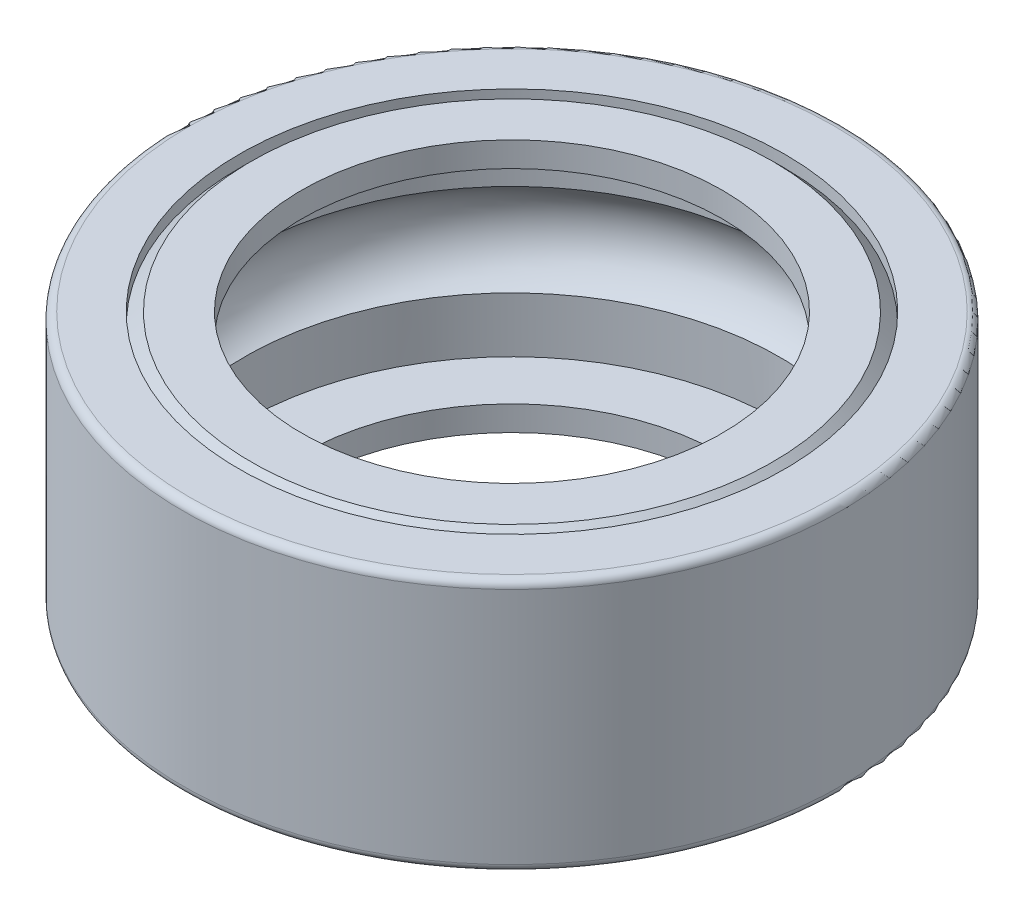
ISO-10303-21;
HEADER;
FILE_DESCRIPTION(('STEP AP214'),'2;1');
FILE_NAME('part.step','',(''),(''),'','','');
FILE_SCHEMA(('AUTOMOTIVE_DESIGN { 1 0 10303 214 1 1 1 1 }'));
ENDSEC;
DATA;
#1=APPLICATION_CONTEXT('core data for automotive mechanical design processes');
#2=APPLICATION_PROTOCOL_DEFINITION('international standard','automotive_design',2000,#1);
#3=PRODUCT_CONTEXT('',#1,'mechanical');
#4=PRODUCT('Part','Part','',(#3));
#5=PRODUCT_RELATED_PRODUCT_CATEGORY('part','',(#4));
#6=PRODUCT_DEFINITION_FORMATION('','',#4);
#7=PRODUCT_DEFINITION_CONTEXT('part definition',#1,'design');
#8=PRODUCT_DEFINITION('design','',#6,#7);
#9=PRODUCT_DEFINITION_SHAPE('','',#8);
#10=(LENGTH_UNIT() NAMED_UNIT(*) SI_UNIT(.MILLI.,.METRE.));
#11=(NAMED_UNIT(*) PLANE_ANGLE_UNIT() SI_UNIT($,.RADIAN.));
#12=(NAMED_UNIT(*) SI_UNIT($,.STERADIAN.) SOLID_ANGLE_UNIT());
#13=UNCERTAINTY_MEASURE_WITH_UNIT(LENGTH_MEASURE(1.E-05),#10,'distance_accuracy_value','');
#14=(GEOMETRIC_REPRESENTATION_CONTEXT(3) GLOBAL_UNCERTAINTY_ASSIGNED_CONTEXT((#13)) GLOBAL_UNIT_ASSIGNED_CONTEXT((#10,
#11,#12)) REPRESENTATION_CONTEXT('',''));
#15=CARTESIAN_POINT('',(0.,0.,0.));
#16=DIRECTION('',(0.,0.,1.));
#17=DIRECTION('',(1.,0.,0.));
#18=AXIS2_PLACEMENT_3D('',#15,#16,#17);
#19=CARTESIAN_POINT('',(0.,-1.04533666301317,0.));
#20=DIRECTION('',(0.,1.,0.));
#21=DIRECTION('',(0.,0.,1.));
#22=AXIS2_PLACEMENT_3D('',#19,#20,#21);
#23=CYLINDRICAL_SURFACE('',#22,5.275);
#24=CARTESIAN_POINT('',(0.,-1.59067332602634,0.));
#25=DIRECTION('',(0.,1.,0.));
#26=DIRECTION('',(0.,0.,1.));
#27=AXIS2_PLACEMENT_3D('',#24,#25,#26);
#28=CIRCLE('',#27,5.275);
#29=CARTESIAN_POINT('',(2.6375,-1.59067332602634,4.56828400496292));
#30=VERTEX_POINT('',#29);
#31=EDGE_CURVE('E97',#30,#30,#28,.T.);
#32=ORIENTED_EDGE('',*,*,#31,.F.);
#33=EDGE_LOOP('',(#32));
#34=FACE_BOUND('',#33,.T.);
#35=CARTESIAN_POINT('',(0.,-0.5,0.));
#36=DIRECTION('',(0.,1.,0.));
#37=DIRECTION('',(0.,0.,1.));
#38=AXIS2_PLACEMENT_3D('',#35,#36,#37);
#39=CIRCLE('',#38,5.275);
#40=CARTESIAN_POINT('',(0.,-0.5,-5.275));
#41=VERTEX_POINT('',#40);
#42=EDGE_CURVE('E11',#41,#41,#39,.T.);
#43=ORIENTED_EDGE('',*,*,#42,.T.);
#44=EDGE_LOOP('',(#43));
#45=FACE_BOUND('',#44,.T.);
#46=ADVANCED_FACE('F17',(#34,#45),#23,.F.);
#47=CARTESIAN_POINT('',(0.,-0.5,5.32775));
#48=DIRECTION('',(0.,1.,0.));
#49=DIRECTION('',(1.,0.,0.));
#50=AXIS2_PLACEMENT_3D('',#47,#48,#49);
#51=PLANE('',#50);
#52=CARTESIAN_POINT('',(0.,-0.5,0.));
#53=DIRECTION('',(0.,1.,0.));
#54=DIRECTION('',(0.,0.,1.));
#55=AXIS2_PLACEMENT_3D('',#52,#53,#54);
#56=CIRCLE('',#55,5.3805);
#57=CARTESIAN_POINT('',(0.,-0.5,-5.3805));
#58=VERTEX_POINT('',#57);
#59=EDGE_CURVE('E109',#58,#58,#56,.T.);
#60=ORIENTED_EDGE('',*,*,#59,.T.);
#61=EDGE_LOOP('',(#60));
#62=FACE_BOUND('',#61,.T.);
#63=ORIENTED_EDGE('',*,*,#42,.F.);
#64=EDGE_LOOP('',(#63));
#65=FACE_BOUND('',#64,.T.);
#66=ADVANCED_FACE('F188',(#62,#65),#51,.T.);
#67=CARTESIAN_POINT('',(0.,-3.95466333698683,0.));
#68=DIRECTION('',(0.,1.,0.));
#69=DIRECTION('',(0.,0.,1.));
#70=AXIS2_PLACEMENT_3D('',#67,#68,#69);
#71=CYLINDRICAL_SURFACE('',#70,5.275);
#72=CARTESIAN_POINT('',(0.,-4.5,0.));
#73=DIRECTION('',(0.,1.,0.));
#74=DIRECTION('',(0.,0.,1.));
#75=AXIS2_PLACEMENT_3D('',#72,#73,#74);
#76=CIRCLE('',#75,5.275);
#77=CARTESIAN_POINT('',(0.,-4.5,-5.275));
#78=VERTEX_POINT('',#77);
#79=EDGE_CURVE('E29',#78,#78,#76,.T.);
#80=ORIENTED_EDGE('',*,*,#79,.F.);
#81=EDGE_LOOP('',(#80));
#82=FACE_BOUND('',#81,.T.);
#83=CARTESIAN_POINT('',(0.,-3.40932667397366,0.));
#84=DIRECTION('',(0.,1.,0.));
#85=DIRECTION('',(0.,0.,1.));
#86=AXIS2_PLACEMENT_3D('',#83,#84,#85);
#87=CIRCLE('',#86,5.275);
#88=CARTESIAN_POINT('',(2.6375,-3.40932667397366,4.56828400496291));
#89=VERTEX_POINT('',#88);
#90=EDGE_CURVE('E107',#89,#89,#87,.T.);
#91=ORIENTED_EDGE('',*,*,#90,.T.);
#92=EDGE_LOOP('',(#91));
#93=FACE_BOUND('',#92,.T.);
#94=ADVANCED_FACE('F193',(#82,#93),#71,.F.);
#95=CARTESIAN_POINT('',(0.,-4.5,5.32775));
#96=DIRECTION('',(0.,-1.,0.));
#97=DIRECTION('',(-1.,0.,0.));
#98=AXIS2_PLACEMENT_3D('',#95,#96,#97);
#99=PLANE('',#98);
#100=ORIENTED_EDGE('',*,*,#79,.T.);
#101=EDGE_LOOP('',(#100));
#102=FACE_BOUND('',#101,.T.);
#103=CARTESIAN_POINT('',(0.,-4.5,0.));
#104=DIRECTION('',(0.,1.,0.));
#105=DIRECTION('',(0.,0.,1.));
#106=AXIS2_PLACEMENT_3D('',#103,#104,#105);
#107=CIRCLE('',#106,5.3805);
#108=CARTESIAN_POINT('',(0.,-4.5,-5.3805));
#109=VERTEX_POINT('',#108);
#110=EDGE_CURVE('E82',#109,#109,#107,.T.);
#111=ORIENTED_EDGE('',*,*,#110,.F.);
#112=EDGE_LOOP('',(#111));
#113=FACE_BOUND('',#112,.T.);
#114=ADVANCED_FACE('F203',(#102,#113),#99,.T.);
#115=CARTESIAN_POINT('',(0.,-0.25,0.));
#116=DIRECTION('',(0.,1.,0.));
#117=DIRECTION('',(0.,0.,1.));
#118=AXIS2_PLACEMENT_3D('',#115,#116,#117);
#119=CYLINDRICAL_SURFACE('',#118,5.3805);
#120=ORIENTED_EDGE('',*,*,#59,.F.);
#121=EDGE_LOOP('',(#120));
#122=FACE_BOUND('',#121,.T.);
#123=CARTESIAN_POINT('',(0.,-0.49,0.));
#124=DIRECTION('',(0.,1.,0.));
#125=DIRECTION('',(0.,0.,1.));
#126=AXIS2_PLACEMENT_3D('',#123,#124,#125);
#127=CIRCLE('',#126,5.3805);
#128=CARTESIAN_POINT('',(0.,-0.49,-5.3805));
#129=VERTEX_POINT('',#128);
#130=EDGE_CURVE('E86',#129,#129,#127,.T.);
#131=ORIENTED_EDGE('',*,*,#130,.T.);
#132=EDGE_LOOP('',(#131));
#133=FACE_BOUND('',#132,.T.);
#134=ADVANCED_FACE('F90',(#122,#133),#119,.F.);
#135=CARTESIAN_POINT('',(0.,-2.5,0.));
#136=DIRECTION('',(0.,1.,0.));
#137=DIRECTION('',(0.,0.,1.));
#138=AXIS2_PLACEMENT_3D('',#135,#136,#137);
#139=TOROIDAL_SURFACE('',#138,4.75,1.05);
#140=ORIENTED_EDGE('',*,*,#90,.F.);
#141=EDGE_LOOP('',(#140));
#142=FACE_BOUND('',#141,.T.);
#143=ORIENTED_EDGE('',*,*,#31,.T.);
#144=EDGE_LOOP('',(#143));
#145=FACE_BOUND('',#144,.T.);
#146=ADVANCED_FACE('F210',(#142,#145),#139,.F.);
#147=CARTESIAN_POINT('',(0.,-4.75,0.));
#148=DIRECTION('',(0.,1.,0.));
#149=DIRECTION('',(0.,0.,1.));
#150=AXIS2_PLACEMENT_3D('',#147,#148,#149);
#151=CYLINDRICAL_SURFACE('',#150,5.3805);
#152=CARTESIAN_POINT('',(0.,-4.51,0.));
#153=DIRECTION('',(0.,-1.,0.));
#154=DIRECTION('',(0.,0.,1.));
#155=AXIS2_PLACEMENT_3D('',#152,#153,#154);
#156=CIRCLE('',#155,5.3805);
#157=CARTESIAN_POINT('',(0.,-4.51,-5.3805));
#158=VERTEX_POINT('',#157);
#159=EDGE_CURVE('E95',#158,#158,#156,.T.);
#160=ORIENTED_EDGE('',*,*,#159,.T.);
#161=EDGE_LOOP('',(#160));
#162=FACE_BOUND('',#161,.T.);
#163=ORIENTED_EDGE('',*,*,#110,.T.);
#164=EDGE_LOOP('',(#163));
#165=FACE_BOUND('',#164,.T.);
#166=ADVANCED_FACE('F201',(#162,#165),#151,.F.);
#167=CARTESIAN_POINT('',(0.,-0.49,4.7655));
#168=DIRECTION('',(0.,-1.,0.));
#169=DIRECTION('',(-1.,0.,0.));
#170=AXIS2_PLACEMENT_3D('',#167,#168,#169);
#171=PLANE('',#170);
#172=CARTESIAN_POINT('',(0.,-0.49,0.));
#173=DIRECTION('',(0.,1.,0.));
#174=DIRECTION('',(0.,0.,1.));
#175=AXIS2_PLACEMENT_3D('',#172,#173,#174);
#176=CIRCLE('',#175,4.1505);
#177=CARTESIAN_POINT('',(0.,-0.49,-4.1505));
#178=VERTEX_POINT('',#177);
#179=EDGE_CURVE('E105',#178,#178,#176,.T.);
#180=ORIENTED_EDGE('',*,*,#179,.T.);
#181=EDGE_LOOP('',(#180));
#182=FACE_BOUND('',#181,.T.);
#183=ORIENTED_EDGE('',*,*,#130,.F.);
#184=EDGE_LOOP('',(#183));
#185=FACE_BOUND('',#184,.T.);
#186=ADVANCED_FACE('F206',(#182,#185),#171,.T.);
#187=CARTESIAN_POINT('',(0.,-4.51,4.7655));
#188=DIRECTION('',(0.,1.,0.));
#189=DIRECTION('',(1.,0.,0.));
#190=AXIS2_PLACEMENT_3D('',#187,#188,#189);
#191=PLANE('',#190);
#192=CARTESIAN_POINT('',(0.,-4.51,0.));
#193=DIRECTION('',(0.,-1.,0.));
#194=DIRECTION('',(0.,0.,1.));
#195=AXIS2_PLACEMENT_3D('',#192,#193,#194);
#196=CIRCLE('',#195,4.1505);
#197=CARTESIAN_POINT('',(0.,-4.51,-4.1505));
#198=VERTEX_POINT('',#197);
#199=EDGE_CURVE('E124',#198,#198,#196,.T.);
#200=ORIENTED_EDGE('',*,*,#199,.T.);
#201=EDGE_LOOP('',(#200));
#202=FACE_BOUND('',#201,.T.);
#203=ORIENTED_EDGE('',*,*,#159,.F.);
#204=EDGE_LOOP('',(#203));
#205=FACE_BOUND('',#204,.T.);
#206=ADVANCED_FACE('F212',(#202,#205),#191,.T.);
#207=CARTESIAN_POINT('',(0.,-0.245,0.));
#208=DIRECTION('',(0.,1.,0.));
#209=DIRECTION('',(0.,0.,1.));
#210=AXIS2_PLACEMENT_3D('',#207,#208,#209);
#211=CYLINDRICAL_SURFACE('',#210,4.1505);
#212=ORIENTED_EDGE('',*,*,#179,.F.);
#213=EDGE_LOOP('',(#212));
#214=FACE_BOUND('',#213,.T.);
#215=CARTESIAN_POINT('',(0.,0.,0.));
#216=DIRECTION('',(0.,1.,0.));
#217=DIRECTION('',(0.,0.,1.));
#218=AXIS2_PLACEMENT_3D('',#215,#216,#217);
#219=CIRCLE('',#218,4.1505);
#220=CARTESIAN_POINT('',(0.,0.,-4.1505));
#221=VERTEX_POINT('',#220);
#222=EDGE_CURVE('E106',#221,#221,#219,.T.);
#223=ORIENTED_EDGE('',*,*,#222,.T.);
#224=EDGE_LOOP('',(#223));
#225=FACE_BOUND('',#224,.T.);
#226=ADVANCED_FACE('F220',(#214,#225),#211,.F.);
#227=CARTESIAN_POINT('',(0.,-4.755,0.));
#228=DIRECTION('',(0.,-1.,0.));
#229=DIRECTION('',(0.,0.,1.));
#230=AXIS2_PLACEMENT_3D('',#227,#228,#229);
#231=CYLINDRICAL_SURFACE('',#230,4.1505);
#232=ORIENTED_EDGE('',*,*,#199,.F.);
#233=EDGE_LOOP('',(#232));
#234=FACE_BOUND('',#233,.T.);
#235=CARTESIAN_POINT('',(0.,-5.,0.));
#236=DIRECTION('',(0.,-1.,0.));
#237=DIRECTION('',(0.,0.,1.));
#238=AXIS2_PLACEMENT_3D('',#235,#236,#237);
#239=CIRCLE('',#238,4.1505);
#240=CARTESIAN_POINT('',(0.,-5.,-4.1505));
#241=VERTEX_POINT('',#240);
#242=EDGE_CURVE('E111',#241,#241,#239,.T.);
#243=ORIENTED_EDGE('',*,*,#242,.T.);
#244=EDGE_LOOP('',(#243));
#245=FACE_BOUND('',#244,.T.);
#246=ADVANCED_FACE('F235',(#234,#245),#231,.F.);
#247=CARTESIAN_POINT('',(0.,0.,4.6455));
#248=DIRECTION('',(0.,1.,0.));
#249=DIRECTION('',(1.,0.,0.));
#250=AXIS2_PLACEMENT_3D('',#247,#248,#249);
#251=PLANE('',#250);
#252=CARTESIAN_POINT('',(0.,0.,0.));
#253=DIRECTION('',(0.,1.,0.));
#254=DIRECTION('',(0.,0.,1.));
#255=AXIS2_PLACEMENT_3D('',#252,#253,#254);
#256=CIRCLE('',#255,5.1405);
#257=CARTESIAN_POINT('',(0.,0.,-5.1405));
#258=VERTEX_POINT('',#257);
#259=EDGE_CURVE('E119',#258,#258,#256,.T.);
#260=ORIENTED_EDGE('',*,*,#259,.T.);
#261=EDGE_LOOP('',(#260));
#262=FACE_BOUND('',#261,.T.);
#263=ORIENTED_EDGE('',*,*,#222,.F.);
#264=EDGE_LOOP('',(#263));
#265=FACE_BOUND('',#264,.T.);
#266=ADVANCED_FACE('F239',(#262,#265),#251,.T.);
#267=CARTESIAN_POINT('',(0.,-5.,4.6455));
#268=DIRECTION('',(0.,-1.,0.));
#269=DIRECTION('',(-1.,0.,0.));
#270=AXIS2_PLACEMENT_3D('',#267,#268,#269);
#271=PLANE('',#270);
#272=CARTESIAN_POINT('',(0.,-5.,0.));
#273=DIRECTION('',(0.,-1.,0.));
#274=DIRECTION('',(0.,0.,1.));
#275=AXIS2_PLACEMENT_3D('',#272,#273,#274);
#276=CIRCLE('',#275,5.1405);
#277=CARTESIAN_POINT('',(0.,-5.,-5.1405));
#278=VERTEX_POINT('',#277);
#279=EDGE_CURVE('E125',#278,#278,#276,.T.);
#280=ORIENTED_EDGE('',*,*,#279,.T.);
#281=EDGE_LOOP('',(#280));
#282=FACE_BOUND('',#281,.T.);
#283=ORIENTED_EDGE('',*,*,#242,.F.);
#284=EDGE_LOOP('',(#283));
#285=FACE_BOUND('',#284,.T.);
#286=ADVANCED_FACE('F242',(#282,#285),#271,.T.);
#287=CARTESIAN_POINT('',(0.,-0.12,0.));
#288=DIRECTION('',(0.,-1.,0.));
#289=DIRECTION('',(0.,0.,1.));
#290=AXIS2_PLACEMENT_3D('',#287,#288,#289);
#291=CONICAL_SURFACE('',#290,5.2605,0.785398163397449);
#292=ORIENTED_EDGE('',*,*,#259,.F.);
#293=EDGE_LOOP('',(#292));
#294=FACE_BOUND('',#293,.T.);
#295=CARTESIAN_POINT('',(0.,-0.24,0.));
#296=DIRECTION('',(0.,1.,0.));
#297=DIRECTION('',(0.,0.,1.));
#298=AXIS2_PLACEMENT_3D('',#295,#296,#297);
#299=CIRCLE('',#298,5.3805);
#300=CARTESIAN_POINT('',(0.,-0.24,-5.3805));
#301=VERTEX_POINT('',#300);
#302=EDGE_CURVE('E128',#301,#301,#299,.T.);
#303=ORIENTED_EDGE('',*,*,#302,.T.);
#304=EDGE_LOOP('',(#303));
#305=FACE_BOUND('',#304,.T.);
#306=ADVANCED_FACE('F215',(#294,#305),#291,.T.);
#307=CARTESIAN_POINT('',(0.,-4.88,0.));
#308=DIRECTION('',(0.,1.,0.));
#309=DIRECTION('',(0.,0.,1.));
#310=AXIS2_PLACEMENT_3D('',#307,#308,#309);
#311=CONICAL_SURFACE('',#310,5.2605,0.785398163397449);
#312=ORIENTED_EDGE('',*,*,#279,.F.);
#313=EDGE_LOOP('',(#312));
#314=FACE_BOUND('',#313,.T.);
#315=CARTESIAN_POINT('',(0.,-4.76,0.));
#316=DIRECTION('',(0.,-1.,0.));
#317=DIRECTION('',(0.,0.,1.));
#318=AXIS2_PLACEMENT_3D('',#315,#316,#317);
#319=CIRCLE('',#318,5.3805);
#320=CARTESIAN_POINT('',(0.,-4.76,-5.3805));
#321=VERTEX_POINT('',#320);
#322=EDGE_CURVE('E145',#321,#321,#319,.T.);
#323=ORIENTED_EDGE('',*,*,#322,.T.);
#324=EDGE_LOOP('',(#323));
#325=FACE_BOUND('',#324,.T.);
#326=ADVANCED_FACE('F207',(#314,#325),#311,.T.);
#327=CARTESIAN_POINT('',(0.,-0.25,0.));
#328=DIRECTION('',(0.,1.,0.));
#329=DIRECTION('',(0.,0.,1.));
#330=AXIS2_PLACEMENT_3D('',#327,#328,#329);
#331=CYLINDRICAL_SURFACE('',#330,5.3805);
#332=ORIENTED_EDGE('',*,*,#302,.F.);
#333=EDGE_LOOP('',(#332));
#334=FACE_BOUND('',#333,.T.);
#335=CARTESIAN_POINT('',(0.,0.,0.));
#336=DIRECTION('',(0.,1.,0.));
#337=DIRECTION('',(0.,0.,1.));
#338=AXIS2_PLACEMENT_3D('',#335,#336,#337);
#339=CIRCLE('',#338,5.3805);
#340=CARTESIAN_POINT('',(0.,0.,-5.3805));
#341=VERTEX_POINT('',#340);
#342=EDGE_CURVE('E21',#341,#341,#339,.T.);
#343=ORIENTED_EDGE('',*,*,#342,.T.);
#344=EDGE_LOOP('',(#343));
#345=FACE_BOUND('',#344,.T.);
#346=ADVANCED_FACE('F166',(#334,#345),#331,.F.);
#347=CARTESIAN_POINT('',(0.,-4.75,0.));
#348=DIRECTION('',(0.,1.,0.));
#349=DIRECTION('',(0.,0.,1.));
#350=AXIS2_PLACEMENT_3D('',#347,#348,#349);
#351=CYLINDRICAL_SURFACE('',#350,5.3805);
#352=ORIENTED_EDGE('',*,*,#322,.F.);
#353=EDGE_LOOP('',(#352));
#354=FACE_BOUND('',#353,.T.);
#355=CARTESIAN_POINT('',(0.,-5.,0.));
#356=DIRECTION('',(0.,1.,0.));
#357=DIRECTION('',(0.,0.,1.));
#358=AXIS2_PLACEMENT_3D('',#355,#356,#357);
#359=CIRCLE('',#358,5.3805);
#360=CARTESIAN_POINT('',(0.,-5.,-5.3805));
#361=VERTEX_POINT('',#360);
#362=EDGE_CURVE('E129',#361,#361,#359,.T.);
#363=ORIENTED_EDGE('',*,*,#362,.F.);
#364=EDGE_LOOP('',(#363));
#365=FACE_BOUND('',#364,.T.);
#366=ADVANCED_FACE('F19',(#354,#365),#351,.F.);
#367=CARTESIAN_POINT('',(0.,0.,5.86525));
#368=DIRECTION('',(0.,1.,0.));
#369=DIRECTION('',(1.,0.,0.));
#370=AXIS2_PLACEMENT_3D('',#367,#368,#369);
#371=PLANE('',#370);
#372=CARTESIAN_POINT('',(0.,0.,0.));
#373=DIRECTION('',(0.,1.,0.));
#374=DIRECTION('',(0.,0.,1.));
#375=AXIS2_PLACEMENT_3D('',#372,#373,#374);
#376=CIRCLE('',#375,6.35);
#377=CARTESIAN_POINT('',(0.,0.,-6.35));
#378=VERTEX_POINT('',#377);
#379=EDGE_CURVE('E135',#378,#378,#376,.T.);
#380=ORIENTED_EDGE('',*,*,#379,.T.);
#381=EDGE_LOOP('',(#380));
#382=FACE_BOUND('',#381,.T.);
#383=ORIENTED_EDGE('',*,*,#342,.F.);
#384=EDGE_LOOP('',(#383));
#385=FACE_BOUND('',#384,.T.);
#386=ADVANCED_FACE('F174',(#382,#385),#371,.T.);
#387=CARTESIAN_POINT('',(0.,-5.,5.86525));
#388=DIRECTION('',(0.,-1.,0.));
#389=DIRECTION('',(-1.,0.,0.));
#390=AXIS2_PLACEMENT_3D('',#387,#388,#389);
#391=PLANE('',#390);
#392=ORIENTED_EDGE('',*,*,#362,.T.);
#393=EDGE_LOOP('',(#392));
#394=FACE_BOUND('',#393,.T.);
#395=CARTESIAN_POINT('',(0.,-5.,0.));
#396=DIRECTION('',(0.,1.,0.));
#397=DIRECTION('',(0.,0.,1.));
#398=AXIS2_PLACEMENT_3D('',#395,#396,#397);
#399=CIRCLE('',#398,6.35);
#400=CARTESIAN_POINT('',(0.,-5.,-6.35));
#401=VERTEX_POINT('',#400);
#402=EDGE_CURVE('E146',#401,#401,#399,.T.);
#403=ORIENTED_EDGE('',*,*,#402,.F.);
#404=EDGE_LOOP('',(#403));
#405=FACE_BOUND('',#404,.T.);
#406=ADVANCED_FACE('F175',(#394,#405),#391,.T.);
#407=CARTESIAN_POINT('',(0.,-0.15,0.));
#408=DIRECTION('',(0.,1.,0.));
#409=DIRECTION('',(0.,0.,1.));
#410=AXIS2_PLACEMENT_3D('',#407,#408,#409);
#411=TOROIDAL_SURFACE('',#410,6.35,0.15);
#412=ORIENTED_EDGE('',*,*,#379,.F.);
#413=EDGE_LOOP('',(#412));
#414=FACE_BOUND('',#413,.T.);
#415=CARTESIAN_POINT('',(0.,-0.15,0.));
#416=DIRECTION('',(0.,1.,0.));
#417=DIRECTION('',(0.,0.,1.));
#418=AXIS2_PLACEMENT_3D('',#415,#416,#417);
#419=CIRCLE('',#418,6.5);
#420=CARTESIAN_POINT('',(0.,-0.15,-6.5));
#421=VERTEX_POINT('',#420);
#422=EDGE_CURVE('E143',#421,#421,#419,.T.);
#423=ORIENTED_EDGE('',*,*,#422,.T.);
#424=EDGE_LOOP('',(#423));
#425=FACE_BOUND('',#424,.T.);
#426=ADVANCED_FACE('F183',(#414,#425),#411,.T.);
#427=CARTESIAN_POINT('',(0.,-4.85,0.));
#428=DIRECTION('',(0.,1.,0.));
#429=DIRECTION('',(0.,0.,1.));
#430=AXIS2_PLACEMENT_3D('',#427,#428,#429);
#431=TOROIDAL_SURFACE('',#430,6.35,0.15);
#432=CARTESIAN_POINT('',(0.,-4.85,0.));
#433=DIRECTION('',(0.,1.,0.));
#434=DIRECTION('',(0.,0.,1.));
#435=AXIS2_PLACEMENT_3D('',#432,#433,#434);
#436=CIRCLE('',#435,6.5);
#437=CARTESIAN_POINT('',(0.,-4.85,-6.5));
#438=VERTEX_POINT('',#437);
#439=EDGE_CURVE('E140',#438,#438,#436,.T.);
#440=ORIENTED_EDGE('',*,*,#439,.F.);
#441=EDGE_LOOP('',(#440));
#442=FACE_BOUND('',#441,.T.);
#443=ORIENTED_EDGE('',*,*,#402,.T.);
#444=EDGE_LOOP('',(#443));
#445=FACE_BOUND('',#444,.T.);
#446=ADVANCED_FACE('F225',(#442,#445),#431,.T.);
#447=CARTESIAN_POINT('',(0.,-2.5,0.));
#448=DIRECTION('',(0.,1.,0.));
#449=DIRECTION('',(0.,0.,1.));
#450=AXIS2_PLACEMENT_3D('',#447,#448,#449);
#451=CYLINDRICAL_SURFACE('',#450,6.5);
#452=ORIENTED_EDGE('',*,*,#422,.F.);
#453=EDGE_LOOP('',(#452));
#454=FACE_BOUND('',#453,.T.);
#455=ORIENTED_EDGE('',*,*,#439,.T.);
#456=EDGE_LOOP('',(#455));
#457=FACE_BOUND('',#456,.T.);
#458=ADVANCED_FACE('F218',(#454,#457),#451,.T.);
#459=CLOSED_SHELL('',(#46,#66,#94,#114,#134,#146,#166,#186,#206,#226,#246,#266,#286,#306,#326,
#346,#366,#386,#406,#426,#446,#458));
#460=MANIFOLD_SOLID_BREP('B1',#459);
#461=ADVANCED_BREP_SHAPE_REPRESENTATION('',(#18,#460),#14);
#462=SHAPE_DEFINITION_REPRESENTATION(#9,#461);
ENDSEC;
END-ISO-10303-21;
